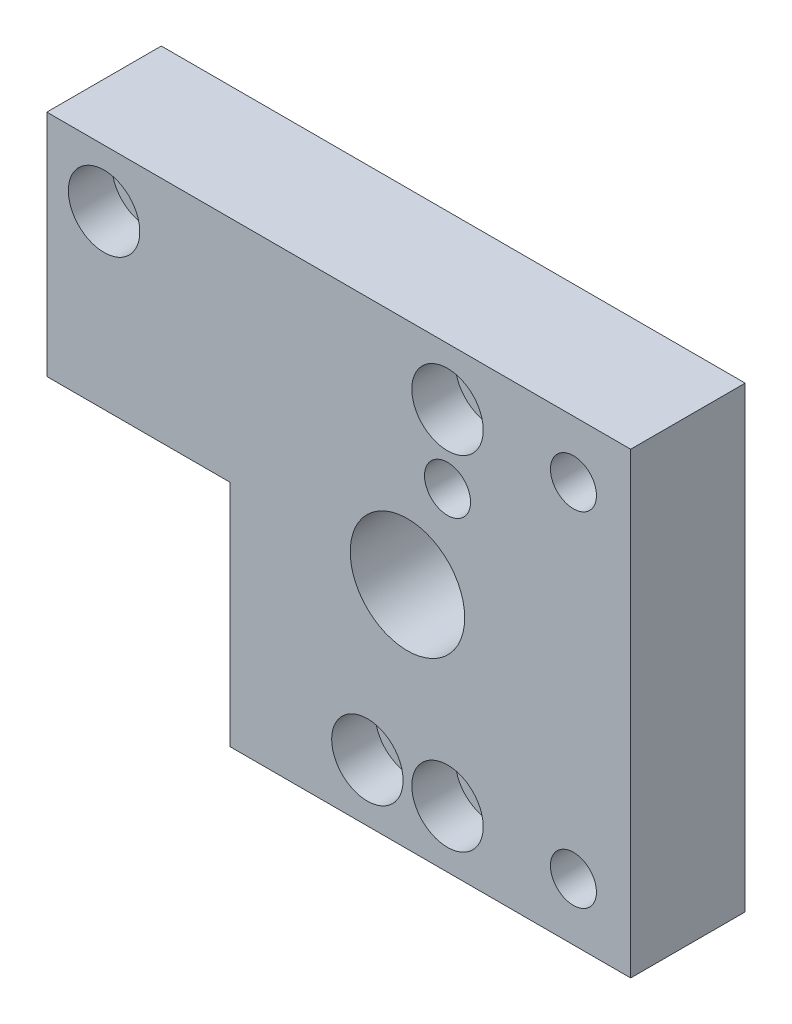
ISO-10303-21;
HEADER;
FILE_DESCRIPTION(('STEP AP214'),'2;1');
FILE_NAME('part.step','',(''),(''),'','','');
FILE_SCHEMA(('AUTOMOTIVE_DESIGN { 1 0 10303 214 1 1 1 1 }'));
ENDSEC;
DATA;
#1=APPLICATION_CONTEXT('core data for automotive mechanical design processes');
#2=APPLICATION_PROTOCOL_DEFINITION('international standard','automotive_design',2000,#1);
#3=PRODUCT_CONTEXT('',#1,'mechanical');
#4=PRODUCT('Part','Part','',(#3));
#5=PRODUCT_RELATED_PRODUCT_CATEGORY('part','',(#4));
#6=PRODUCT_DEFINITION_FORMATION('','',#4);
#7=PRODUCT_DEFINITION_CONTEXT('part definition',#1,'design');
#8=PRODUCT_DEFINITION('design','',#6,#7);
#9=PRODUCT_DEFINITION_SHAPE('','',#8);
#10=(LENGTH_UNIT() NAMED_UNIT(*) SI_UNIT(.MILLI.,.METRE.));
#11=(NAMED_UNIT(*) PLANE_ANGLE_UNIT() SI_UNIT($,.RADIAN.));
#12=(NAMED_UNIT(*) SI_UNIT($,.STERADIAN.) SOLID_ANGLE_UNIT());
#13=UNCERTAINTY_MEASURE_WITH_UNIT(LENGTH_MEASURE(1.E-05),#10,'distance_accuracy_value','');
#14=(GEOMETRIC_REPRESENTATION_CONTEXT(3) GLOBAL_UNCERTAINTY_ASSIGNED_CONTEXT((#13)) GLOBAL_UNIT_ASSIGNED_CONTEXT((#10,
#11,#12)) REPRESENTATION_CONTEXT('',''));
#15=CARTESIAN_POINT('',(0.,0.,0.));
#16=DIRECTION('',(0.,0.,1.));
#17=DIRECTION('',(1.,0.,0.));
#18=AXIS2_PLACEMENT_3D('',#15,#16,#17);
#19=CARTESIAN_POINT('',(0.,0.,12.7));
#20=DIRECTION('',(0.,0.,-1.));
#21=DIRECTION('',(-1.,0.,0.));
#22=AXIS2_PLACEMENT_3D('',#19,#20,#21);
#23=PLANE('',#22);
#24=CARTESIAN_POINT('',(19.05,-19.05,12.7));
#25=DIRECTION('',(0.,0.,-1.));
#26=DIRECTION('',(-1.,0.,0.));
#27=AXIS2_PLACEMENT_3D('',#24,#25,#26);
#28=CIRCLE('',#27,3.9624);
#29=CARTESIAN_POINT('',(15.0876,-19.05,12.7));
#30=VERTEX_POINT('',#29);
#31=EDGE_CURVE('E152',#30,#30,#28,.T.);
#32=ORIENTED_EDGE('',*,*,#31,.T.);
#33=EDGE_LOOP('',(#32));
#34=FACE_BOUND('',#33,.T.);
#35=CARTESIAN_POINT('',(19.05,19.05,12.7));
#36=DIRECTION('',(0.,0.,-1.));
#37=DIRECTION('',(-1.,0.,0.));
#38=AXIS2_PLACEMENT_3D('',#35,#36,#37);
#39=CIRCLE('',#38,3.9624);
#40=CARTESIAN_POINT('',(15.0876,19.05,12.7));
#41=VERTEX_POINT('',#40);
#42=EDGE_CURVE('E141',#41,#41,#39,.T.);
#43=ORIENTED_EDGE('',*,*,#42,.T.);
#44=EDGE_LOOP('',(#43));
#45=FACE_BOUND('',#44,.T.);
#46=CARTESIAN_POINT('',(33.02,-19.05,12.7));
#47=DIRECTION('',(0.,0.,-1.));
#48=DIRECTION('',(-1.,0.,0.));
#49=AXIS2_PLACEMENT_3D('',#46,#47,#48);
#50=CIRCLE('',#49,2.55269999999999);
#51=CARTESIAN_POINT('',(30.4673,-19.05,12.7));
#52=VERTEX_POINT('',#51);
#53=EDGE_CURVE('E170',#52,#52,#50,.T.);
#54=ORIENTED_EDGE('',*,*,#53,.T.);
#55=EDGE_LOOP('',(#54));
#56=FACE_BOUND('',#55,.T.);
#57=CARTESIAN_POINT('',(33.02,19.05,12.7));
#58=DIRECTION('',(0.,0.,-1.));
#59=DIRECTION('',(-1.,0.,0.));
#60=AXIS2_PLACEMENT_3D('',#57,#58,#59);
#61=CIRCLE('',#60,2.55269999999999);
#62=CARTESIAN_POINT('',(30.4673,19.05,12.7));
#63=VERTEX_POINT('',#62);
#64=EDGE_CURVE('E176',#63,#63,#61,.T.);
#65=ORIENTED_EDGE('',*,*,#64,.T.);
#66=EDGE_LOOP('',(#65));
#67=FACE_BOUND('',#66,.T.);
#68=CARTESIAN_POINT('',(19.05,11.43,12.7));
#69=DIRECTION('',(0.,0.,-1.));
#70=DIRECTION('',(-1.,0.,0.));
#71=AXIS2_PLACEMENT_3D('',#68,#69,#70);
#72=CIRCLE('',#71,2.55269999999999);
#73=CARTESIAN_POINT('',(16.4973,11.43,12.7));
#74=VERTEX_POINT('',#73);
#75=EDGE_CURVE('E182',#74,#74,#72,.T.);
#76=ORIENTED_EDGE('',*,*,#75,.T.);
#77=EDGE_LOOP('',(#76));
#78=FACE_BOUND('',#77,.T.);
#79=DIRECTION('',(1.,0.,0.));
#80=VECTOR('',#79,1.);
#81=CARTESIAN_POINT('',(-25.4,0.,12.7));
#82=LINE('',#81,#80);
#83=CARTESIAN_POINT('',(-25.4,0.,12.7));
#84=VERTEX_POINT('',#83);
#85=CARTESIAN_POINT('',(-5.08,0.,12.7));
#86=VERTEX_POINT('',#85);
#87=EDGE_CURVE('E96',#84,#86,#82,.T.);
#88=ORIENTED_EDGE('',*,*,#87,.T.);
#89=DIRECTION('',(0.,-1.,0.));
#90=VECTOR('',#89,1.);
#91=CARTESIAN_POINT('',(-5.08,-25.4,12.7));
#92=LINE('',#91,#90);
#93=CARTESIAN_POINT('',(-5.08,-25.4,12.7));
#94=VERTEX_POINT('',#93);
#95=EDGE_CURVE('E105',#86,#94,#92,.T.);
#96=ORIENTED_EDGE('',*,*,#95,.T.);
#97=DIRECTION('',(1.,0.,0.));
#98=VECTOR('',#97,1.);
#99=CARTESIAN_POINT('',(-25.4,-25.4,12.7));
#100=LINE('',#99,#98);
#101=CARTESIAN_POINT('',(39.37,-25.4,12.7));
#102=VERTEX_POINT('',#101);
#103=EDGE_CURVE('E59',#94,#102,#100,.T.);
#104=ORIENTED_EDGE('',*,*,#103,.T.);
#105=DIRECTION('',(0.,1.,0.));
#106=VECTOR('',#105,1.);
#107=CARTESIAN_POINT('',(39.37,-25.4,12.7));
#108=LINE('',#107,#106);
#109=CARTESIAN_POINT('',(39.37,25.4,12.7));
#110=VERTEX_POINT('',#109);
#111=EDGE_CURVE('E120',#102,#110,#108,.T.);
#112=ORIENTED_EDGE('',*,*,#111,.T.);
#113=DIRECTION('',(-1.,0.,0.));
#114=VECTOR('',#113,1.);
#115=CARTESIAN_POINT('',(-25.4,25.4,12.7));
#116=LINE('',#115,#114);
#117=CARTESIAN_POINT('',(-25.4,25.4,12.7));
#118=VERTEX_POINT('',#117);
#119=EDGE_CURVE('E81',#110,#118,#116,.T.);
#120=ORIENTED_EDGE('',*,*,#119,.T.);
#121=DIRECTION('',(0.,-1.,0.));
#122=VECTOR('',#121,1.);
#123=CARTESIAN_POINT('',(-25.4,-25.4,12.7));
#124=LINE('',#123,#122);
#125=EDGE_CURVE('E112',#118,#84,#124,.T.);
#126=ORIENTED_EDGE('',*,*,#125,.T.);
#127=EDGE_LOOP('',(#88,#96,#104,#112,#120,#126));
#128=FACE_BOUND('',#127,.T.);
#129=CARTESIAN_POINT('',(14.605,0.,12.7));
#130=DIRECTION('',(0.,0.,1.));
#131=DIRECTION('',(1.,0.,0.));
#132=AXIS2_PLACEMENT_3D('',#129,#130,#131);
#133=CIRCLE('',#132,6.35);
#134=CARTESIAN_POINT('',(20.955,0.,12.7));
#135=VERTEX_POINT('',#134);
#136=EDGE_CURVE('E186',#135,#135,#133,.T.);
#137=ORIENTED_EDGE('',*,*,#136,.F.);
#138=EDGE_LOOP('',(#137));
#139=FACE_BOUND('',#138,.T.);
#140=CARTESIAN_POINT('',(10.16,-19.05,12.7));
#141=DIRECTION('',(0.,0.,-1.));
#142=DIRECTION('',(-1.,0.,0.));
#143=AXIS2_PLACEMENT_3D('',#140,#141,#142);
#144=CIRCLE('',#143,3.9624);
#145=CARTESIAN_POINT('',(6.1976,-19.05,12.7));
#146=VERTEX_POINT('',#145);
#147=EDGE_CURVE('E145',#146,#146,#144,.T.);
#148=ORIENTED_EDGE('',*,*,#147,.T.);
#149=EDGE_LOOP('',(#148));
#150=FACE_BOUND('',#149,.T.);
#151=CARTESIAN_POINT('',(-19.05,19.05,12.7));
#152=DIRECTION('',(0.,0.,-1.));
#153=DIRECTION('',(-1.,0.,0.));
#154=AXIS2_PLACEMENT_3D('',#151,#152,#153);
#155=CIRCLE('',#154,3.9624);
#156=CARTESIAN_POINT('',(-23.0124,19.05,12.7));
#157=VERTEX_POINT('',#156);
#158=EDGE_CURVE('E159',#157,#157,#155,.T.);
#159=ORIENTED_EDGE('',*,*,#158,.T.);
#160=EDGE_LOOP('',(#159));
#161=FACE_BOUND('',#160,.T.);
#162=ADVANCED_FACE('F33',(#34,#45,#56,#67,#78,#128,#139,#150,#161),#23,.F.);
#163=CARTESIAN_POINT('',(0.,0.,0.));
#164=DIRECTION('',(0.,0.,-1.));
#165=DIRECTION('',(-1.,0.,0.));
#166=AXIS2_PLACEMENT_3D('',#163,#164,#165);
#167=PLANE('',#166);
#168=DIRECTION('',(0.,-1.,0.));
#169=VECTOR('',#168,1.);
#170=CARTESIAN_POINT('',(-5.08,-25.4,0.));
#171=LINE('',#170,#169);
#172=CARTESIAN_POINT('',(-5.08,0.,0.));
#173=VERTEX_POINT('',#172);
#174=CARTESIAN_POINT('',(-5.08,-25.4,0.));
#175=VERTEX_POINT('',#174);
#176=EDGE_CURVE('E50',#173,#175,#171,.T.);
#177=ORIENTED_EDGE('',*,*,#176,.F.);
#178=DIRECTION('',(1.,0.,0.));
#179=VECTOR('',#178,1.);
#180=CARTESIAN_POINT('',(-25.4,0.,0.));
#181=LINE('',#180,#179);
#182=CARTESIAN_POINT('',(-25.4,0.,0.));
#183=VERTEX_POINT('',#182);
#184=EDGE_CURVE('E209',#183,#173,#181,.T.);
#185=ORIENTED_EDGE('',*,*,#184,.F.);
#186=DIRECTION('',(0.,-1.,0.));
#187=VECTOR('',#186,1.);
#188=CARTESIAN_POINT('',(-25.4,-25.4,0.));
#189=LINE('',#188,#187);
#190=CARTESIAN_POINT('',(-25.4,25.4,0.));
#191=VERTEX_POINT('',#190);
#192=EDGE_CURVE('E114',#191,#183,#189,.T.);
#193=ORIENTED_EDGE('',*,*,#192,.F.);
#194=DIRECTION('',(-1.,0.,0.));
#195=VECTOR('',#194,1.);
#196=CARTESIAN_POINT('',(-25.4,25.4,0.));
#197=LINE('',#196,#195);
#198=CARTESIAN_POINT('',(39.37,25.4,0.));
#199=VERTEX_POINT('',#198);
#200=EDGE_CURVE('E127',#199,#191,#197,.T.);
#201=ORIENTED_EDGE('',*,*,#200,.F.);
#202=DIRECTION('',(0.,1.,0.));
#203=VECTOR('',#202,1.);
#204=CARTESIAN_POINT('',(39.37,-25.4,0.));
#205=LINE('',#204,#203);
#206=CARTESIAN_POINT('',(39.37,-25.4,0.));
#207=VERTEX_POINT('',#206);
#208=EDGE_CURVE('E124',#207,#199,#205,.T.);
#209=ORIENTED_EDGE('',*,*,#208,.F.);
#210=DIRECTION('',(1.,0.,0.));
#211=VECTOR('',#210,1.);
#212=CARTESIAN_POINT('',(-25.4,-25.4,0.));
#213=LINE('',#212,#211);
#214=EDGE_CURVE('E76',#175,#207,#213,.T.);
#215=ORIENTED_EDGE('',*,*,#214,.F.);
#216=EDGE_LOOP('',(#177,#185,#193,#201,#209,#215));
#217=FACE_BOUND('',#216,.T.);
#218=CARTESIAN_POINT('',(33.02,-19.05,0.));
#219=DIRECTION('',(0.,0.,-1.));
#220=DIRECTION('',(-1.,0.,0.));
#221=AXIS2_PLACEMENT_3D('',#218,#219,#220);
#222=CIRCLE('',#221,2.55269999999999);
#223=CARTESIAN_POINT('',(30.4673,-19.05,0.));
#224=VERTEX_POINT('',#223);
#225=EDGE_CURVE('E137',#224,#224,#222,.T.);
#226=ORIENTED_EDGE('',*,*,#225,.F.);
#227=EDGE_LOOP('',(#226));
#228=FACE_BOUND('',#227,.T.);
#229=CARTESIAN_POINT('',(33.02,19.05,0.));
#230=DIRECTION('',(0.,0.,-1.));
#231=DIRECTION('',(-1.,0.,0.));
#232=AXIS2_PLACEMENT_3D('',#229,#230,#231);
#233=CIRCLE('',#232,2.55269999999999);
#234=CARTESIAN_POINT('',(30.4673,19.05,0.));
#235=VERTEX_POINT('',#234);
#236=EDGE_CURVE('E173',#235,#235,#233,.T.);
#237=ORIENTED_EDGE('',*,*,#236,.F.);
#238=EDGE_LOOP('',(#237));
#239=FACE_BOUND('',#238,.T.);
#240=CARTESIAN_POINT('',(19.05,11.43,0.));
#241=DIRECTION('',(0.,0.,-1.));
#242=DIRECTION('',(-1.,0.,0.));
#243=AXIS2_PLACEMENT_3D('',#240,#241,#242);
#244=CIRCLE('',#243,2.55269999999999);
#245=CARTESIAN_POINT('',(16.4973,11.43,0.));
#246=VERTEX_POINT('',#245);
#247=EDGE_CURVE('E179',#246,#246,#244,.T.);
#248=ORIENTED_EDGE('',*,*,#247,.F.);
#249=EDGE_LOOP('',(#248));
#250=FACE_BOUND('',#249,.T.);
#251=CARTESIAN_POINT('',(10.16,-19.05,0.));
#252=DIRECTION('',(0.,0.,1.));
#253=DIRECTION('',(1.,0.,0.));
#254=AXIS2_PLACEMENT_3D('',#251,#252,#253);
#255=CIRCLE('',#254,2.5527);
#256=CARTESIAN_POINT('',(12.7127,-19.05,0.));
#257=VERTEX_POINT('',#256);
#258=EDGE_CURVE('E189',#257,#257,#255,.T.);
#259=ORIENTED_EDGE('',*,*,#258,.T.);
#260=EDGE_LOOP('',(#259));
#261=FACE_BOUND('',#260,.T.);
#262=CARTESIAN_POINT('',(19.05,19.05,0.));
#263=DIRECTION('',(0.,0.,1.));
#264=DIRECTION('',(1.,0.,0.));
#265=AXIS2_PLACEMENT_3D('',#262,#263,#264);
#266=CIRCLE('',#265,2.55269999999999);
#267=CARTESIAN_POINT('',(21.6027,19.05,0.));
#268=VERTEX_POINT('',#267);
#269=EDGE_CURVE('E197',#268,#268,#266,.T.);
#270=ORIENTED_EDGE('',*,*,#269,.T.);
#271=EDGE_LOOP('',(#270));
#272=FACE_BOUND('',#271,.T.);
#273=CARTESIAN_POINT('',(-19.05,19.05,0.));
#274=DIRECTION('',(0.,0.,1.));
#275=DIRECTION('',(-1.,0.,0.));
#276=AXIS2_PLACEMENT_3D('',#273,#274,#275);
#277=CIRCLE('',#276,2.55269999999999);
#278=CARTESIAN_POINT('',(-21.6027,19.05,0.));
#279=VERTEX_POINT('',#278);
#280=EDGE_CURVE('E128',#279,#279,#277,.T.);
#281=ORIENTED_EDGE('',*,*,#280,.T.);
#282=EDGE_LOOP('',(#281));
#283=FACE_BOUND('',#282,.T.);
#284=CARTESIAN_POINT('',(19.05,-19.05,0.));
#285=DIRECTION('',(0.,0.,1.));
#286=DIRECTION('',(1.,0.,0.));
#287=AXIS2_PLACEMENT_3D('',#284,#285,#286);
#288=CIRCLE('',#287,2.5527);
#289=CARTESIAN_POINT('',(21.6027,-19.05,0.));
#290=VERTEX_POINT('',#289);
#291=EDGE_CURVE('E194',#290,#290,#288,.T.);
#292=ORIENTED_EDGE('',*,*,#291,.T.);
#293=EDGE_LOOP('',(#292));
#294=FACE_BOUND('',#293,.T.);
#295=CARTESIAN_POINT('',(14.605,0.,0.));
#296=DIRECTION('',(0.,0.,1.));
#297=DIRECTION('',(1.,0.,0.));
#298=AXIS2_PLACEMENT_3D('',#295,#296,#297);
#299=CIRCLE('',#298,6.35);
#300=CARTESIAN_POINT('',(20.955,0.,0.));
#301=VERTEX_POINT('',#300);
#302=EDGE_CURVE('E185',#301,#301,#299,.T.);
#303=ORIENTED_EDGE('',*,*,#302,.T.);
#304=EDGE_LOOP('',(#303));
#305=FACE_BOUND('',#304,.T.);
#306=ADVANCED_FACE('F207',(#217,#228,#239,#250,#261,#272,#283,#294,#305),#167,.T.);
#307=CARTESIAN_POINT('',(39.37,-25.4,12.7));
#308=DIRECTION('',(-1.,0.,0.));
#309=DIRECTION('',(0.,0.,1.));
#310=AXIS2_PLACEMENT_3D('',#307,#308,#309);
#311=PLANE('',#310);
#312=ORIENTED_EDGE('',*,*,#208,.T.);
#313=DIRECTION('',(0.,0.,-1.));
#314=VECTOR('',#313,1.);
#315=CARTESIAN_POINT('',(39.37,25.4,12.7));
#316=LINE('',#315,#314);
#317=EDGE_CURVE('E11',#110,#199,#316,.T.);
#318=ORIENTED_EDGE('',*,*,#317,.F.);
#319=ORIENTED_EDGE('',*,*,#111,.F.);
#320=DIRECTION('',(0.,0.,-1.));
#321=VECTOR('',#320,1.);
#322=CARTESIAN_POINT('',(39.37,-25.4,12.7));
#323=LINE('',#322,#321);
#324=EDGE_CURVE('E118',#102,#207,#323,.T.);
#325=ORIENTED_EDGE('',*,*,#324,.T.);
#326=EDGE_LOOP('',(#312,#318,#319,#325));
#327=FACE_BOUND('',#326,.T.);
#328=ADVANCED_FACE('F35',(#327),#311,.F.);
#329=CARTESIAN_POINT('',(-25.4,25.4,12.7));
#330=DIRECTION('',(0.,-1.,0.));
#331=DIRECTION('',(1.,0.,0.));
#332=AXIS2_PLACEMENT_3D('',#329,#330,#331);
#333=PLANE('',#332);
#334=ORIENTED_EDGE('',*,*,#200,.T.);
#335=DIRECTION('',(0.,0.,-1.));
#336=VECTOR('',#335,1.);
#337=CARTESIAN_POINT('',(-25.4,25.4,12.7));
#338=LINE('',#337,#336);
#339=EDGE_CURVE('E42',#118,#191,#338,.T.);
#340=ORIENTED_EDGE('',*,*,#339,.F.);
#341=ORIENTED_EDGE('',*,*,#119,.F.);
#342=ORIENTED_EDGE('',*,*,#317,.T.);
#343=EDGE_LOOP('',(#334,#340,#341,#342));
#344=FACE_BOUND('',#343,.T.);
#345=ADVANCED_FACE('F205',(#344),#333,.F.);
#346=CARTESIAN_POINT('',(-25.4,-25.4,12.7));
#347=DIRECTION('',(1.,0.,0.));
#348=DIRECTION('',(0.,0.,-1.));
#349=AXIS2_PLACEMENT_3D('',#346,#347,#348);
#350=PLANE('',#349);
#351=ORIENTED_EDGE('',*,*,#192,.T.);
#352=DIRECTION('',(0.,0.,-1.));
#353=VECTOR('',#352,1.);
#354=CARTESIAN_POINT('',(-25.4,0.,12.7));
#355=LINE('',#354,#353);
#356=EDGE_CURVE('E100',#84,#183,#355,.T.);
#357=ORIENTED_EDGE('',*,*,#356,.F.);
#358=ORIENTED_EDGE('',*,*,#125,.F.);
#359=ORIENTED_EDGE('',*,*,#339,.T.);
#360=EDGE_LOOP('',(#351,#357,#358,#359));
#361=FACE_BOUND('',#360,.T.);
#362=ADVANCED_FACE('F110',(#361),#350,.F.);
#363=CARTESIAN_POINT('',(-25.4,-25.4,12.7));
#364=DIRECTION('',(0.,1.,0.));
#365=DIRECTION('',(0.,0.,1.));
#366=AXIS2_PLACEMENT_3D('',#363,#364,#365);
#367=PLANE('',#366);
#368=ORIENTED_EDGE('',*,*,#103,.F.);
#369=DIRECTION('',(0.,0.,-1.));
#370=VECTOR('',#369,1.);
#371=CARTESIAN_POINT('',(-5.08,-25.4,12.7));
#372=LINE('',#371,#370);
#373=EDGE_CURVE('E214',#94,#175,#372,.T.);
#374=ORIENTED_EDGE('',*,*,#373,.T.);
#375=ORIENTED_EDGE('',*,*,#214,.T.);
#376=ORIENTED_EDGE('',*,*,#324,.F.);
#377=EDGE_LOOP('',(#368,#374,#375,#376));
#378=FACE_BOUND('',#377,.T.);
#379=ADVANCED_FACE('F251',(#378),#367,.F.);
#380=CARTESIAN_POINT('',(-19.05,19.05,12.7));
#381=DIRECTION('',(0.,0.,-1.));
#382=DIRECTION('',(-1.,0.,0.));
#383=AXIS2_PLACEMENT_3D('',#380,#381,#382);
#384=CYLINDRICAL_SURFACE('',#383,2.55269999999999);
#385=CARTESIAN_POINT('',(-19.05,19.05,7.874));
#386=DIRECTION('',(0.,0.,-1.));
#387=DIRECTION('',(-1.,0.,0.));
#388=AXIS2_PLACEMENT_3D('',#385,#386,#387);
#389=CIRCLE('',#388,2.55269999999999);
#390=CARTESIAN_POINT('',(-21.6027,19.05,7.874));
#391=VERTEX_POINT('',#390);
#392=EDGE_CURVE('E37',#391,#391,#389,.T.);
#393=ORIENTED_EDGE('',*,*,#392,.F.);
#394=EDGE_LOOP('',(#393));
#395=FACE_BOUND('',#394,.T.);
#396=ORIENTED_EDGE('',*,*,#280,.F.);
#397=EDGE_LOOP('',(#396));
#398=FACE_BOUND('',#397,.T.);
#399=ADVANCED_FACE('F248',(#395,#398),#384,.F.);
#400=CARTESIAN_POINT('',(19.05,19.05,12.7));
#401=DIRECTION('',(0.,0.,-1.));
#402=DIRECTION('',(-1.,0.,0.));
#403=AXIS2_PLACEMENT_3D('',#400,#401,#402);
#404=CYLINDRICAL_SURFACE('',#403,2.55269999999999);
#405=CARTESIAN_POINT('',(19.05,19.05,7.874));
#406=DIRECTION('',(0.,0.,-1.));
#407=DIRECTION('',(-1.,0.,0.));
#408=AXIS2_PLACEMENT_3D('',#405,#406,#407);
#409=CIRCLE('',#408,2.55269999999999);
#410=CARTESIAN_POINT('',(16.4973,19.05,7.874));
#411=VERTEX_POINT('',#410);
#412=EDGE_CURVE('E134',#411,#411,#409,.T.);
#413=ORIENTED_EDGE('',*,*,#412,.F.);
#414=EDGE_LOOP('',(#413));
#415=FACE_BOUND('',#414,.T.);
#416=ORIENTED_EDGE('',*,*,#269,.F.);
#417=EDGE_LOOP('',(#416));
#418=FACE_BOUND('',#417,.T.);
#419=ADVANCED_FACE('F387',(#415,#418),#404,.F.);
#420=CARTESIAN_POINT('',(19.05,-19.05,12.7));
#421=DIRECTION('',(0.,0.,-1.));
#422=DIRECTION('',(-1.,0.,0.));
#423=AXIS2_PLACEMENT_3D('',#420,#421,#422);
#424=CYLINDRICAL_SURFACE('',#423,2.5527);
#425=CARTESIAN_POINT('',(19.05,-19.05,7.874));
#426=DIRECTION('',(0.,0.,-1.));
#427=DIRECTION('',(-1.,0.,0.));
#428=AXIS2_PLACEMENT_3D('',#425,#426,#427);
#429=CIRCLE('',#428,2.5527);
#430=CARTESIAN_POINT('',(16.4973,-19.05,7.874));
#431=VERTEX_POINT('',#430);
#432=EDGE_CURVE('E143',#431,#431,#429,.T.);
#433=ORIENTED_EDGE('',*,*,#432,.F.);
#434=EDGE_LOOP('',(#433));
#435=FACE_BOUND('',#434,.T.);
#436=ORIENTED_EDGE('',*,*,#291,.F.);
#437=EDGE_LOOP('',(#436));
#438=FACE_BOUND('',#437,.T.);
#439=ADVANCED_FACE('F375',(#435,#438),#424,.F.);
#440=CARTESIAN_POINT('',(10.16,-19.05,12.7));
#441=DIRECTION('',(0.,0.,-1.));
#442=DIRECTION('',(-1.,0.,0.));
#443=AXIS2_PLACEMENT_3D('',#440,#441,#442);
#444=CYLINDRICAL_SURFACE('',#443,2.5527);
#445=CARTESIAN_POINT('',(10.16,-19.05,7.874));
#446=DIRECTION('',(0.,0.,-1.));
#447=DIRECTION('',(-1.,0.,0.));
#448=AXIS2_PLACEMENT_3D('',#445,#446,#447);
#449=CIRCLE('',#448,2.5527);
#450=CARTESIAN_POINT('',(7.6073,-19.05,7.874));
#451=VERTEX_POINT('',#450);
#452=EDGE_CURVE('E139',#451,#451,#449,.T.);
#453=ORIENTED_EDGE('',*,*,#452,.F.);
#454=EDGE_LOOP('',(#453));
#455=FACE_BOUND('',#454,.T.);
#456=ORIENTED_EDGE('',*,*,#258,.F.);
#457=EDGE_LOOP('',(#456));
#458=FACE_BOUND('',#457,.T.);
#459=ADVANCED_FACE('F369',(#455,#458),#444,.F.);
#460=CARTESIAN_POINT('',(14.605,0.,12.7));
#461=DIRECTION('',(0.,0.,-1.));
#462=DIRECTION('',(-1.,0.,0.));
#463=AXIS2_PLACEMENT_3D('',#460,#461,#462);
#464=CYLINDRICAL_SURFACE('',#463,6.35);
#465=ORIENTED_EDGE('',*,*,#136,.T.);
#466=EDGE_LOOP('',(#465));
#467=FACE_BOUND('',#466,.T.);
#468=ORIENTED_EDGE('',*,*,#302,.F.);
#469=EDGE_LOOP('',(#468));
#470=FACE_BOUND('',#469,.T.);
#471=ADVANCED_FACE('F374',(#467,#470),#464,.F.);
#472=CARTESIAN_POINT('',(19.05,11.43,0.));
#473=DIRECTION('',(0.,0.,-1.));
#474=DIRECTION('',(-1.,0.,0.));
#475=AXIS2_PLACEMENT_3D('',#472,#473,#474);
#476=CYLINDRICAL_SURFACE('',#475,2.55269999999999);
#477=ORIENTED_EDGE('',*,*,#247,.T.);
#478=EDGE_LOOP('',(#477));
#479=FACE_BOUND('',#478,.T.);
#480=ORIENTED_EDGE('',*,*,#75,.F.);
#481=EDGE_LOOP('',(#480));
#482=FACE_BOUND('',#481,.T.);
#483=ADVANCED_FACE('F420',(#479,#482),#476,.F.);
#484=CARTESIAN_POINT('',(33.02,19.05,0.));
#485=DIRECTION('',(0.,0.,-1.));
#486=DIRECTION('',(-1.,0.,0.));
#487=AXIS2_PLACEMENT_3D('',#484,#485,#486);
#488=CYLINDRICAL_SURFACE('',#487,2.55269999999999);
#489=ORIENTED_EDGE('',*,*,#236,.T.);
#490=EDGE_LOOP('',(#489));
#491=FACE_BOUND('',#490,.T.);
#492=ORIENTED_EDGE('',*,*,#64,.F.);
#493=EDGE_LOOP('',(#492));
#494=FACE_BOUND('',#493,.T.);
#495=ADVANCED_FACE('F410',(#491,#494),#488,.F.);
#496=CARTESIAN_POINT('',(33.02,-19.05,0.));
#497=DIRECTION('',(0.,0.,-1.));
#498=DIRECTION('',(-1.,0.,0.));
#499=AXIS2_PLACEMENT_3D('',#496,#497,#498);
#500=CYLINDRICAL_SURFACE('',#499,2.55269999999999);
#501=ORIENTED_EDGE('',*,*,#225,.T.);
#502=EDGE_LOOP('',(#501));
#503=FACE_BOUND('',#502,.T.);
#504=ORIENTED_EDGE('',*,*,#53,.F.);
#505=EDGE_LOOP('',(#504));
#506=FACE_BOUND('',#505,.T.);
#507=ADVANCED_FACE('F362',(#503,#506),#500,.F.);
#508=CARTESIAN_POINT('',(19.05,19.05,7.874));
#509=DIRECTION('',(0.,0.,1.));
#510=DIRECTION('',(1.,0.,0.));
#511=AXIS2_PLACEMENT_3D('',#508,#509,#510);
#512=CYLINDRICAL_SURFACE('',#511,3.9624);
#513=CARTESIAN_POINT('',(19.05,19.05,7.874));
#514=DIRECTION('',(0.,0.,-1.));
#515=DIRECTION('',(-1.,0.,0.));
#516=AXIS2_PLACEMENT_3D('',#513,#514,#515);
#517=CIRCLE('',#516,3.9624);
#518=CARTESIAN_POINT('',(15.0876,19.05,7.874));
#519=VERTEX_POINT('',#518);
#520=EDGE_CURVE('E138',#519,#519,#517,.T.);
#521=ORIENTED_EDGE('',*,*,#520,.T.);
#522=EDGE_LOOP('',(#521));
#523=FACE_BOUND('',#522,.T.);
#524=ORIENTED_EDGE('',*,*,#42,.F.);
#525=EDGE_LOOP('',(#524));
#526=FACE_BOUND('',#525,.T.);
#527=ADVANCED_FACE('F352',(#523,#526),#512,.F.);
#528=CARTESIAN_POINT('',(19.05,19.05,7.874));
#529=DIRECTION('',(0.,0.,-1.));
#530=DIRECTION('',(-1.,0.,0.));
#531=AXIS2_PLACEMENT_3D('',#528,#529,#530);
#532=PLANE('',#531);
#533=ORIENTED_EDGE('',*,*,#412,.T.);
#534=EDGE_LOOP('',(#533));
#535=FACE_BOUND('',#534,.T.);
#536=ORIENTED_EDGE('',*,*,#520,.F.);
#537=EDGE_LOOP('',(#536));
#538=FACE_BOUND('',#537,.T.);
#539=ADVANCED_FACE('F342',(#535,#538),#532,.F.);
#540=CARTESIAN_POINT('',(10.16,-19.05,7.874));
#541=DIRECTION('',(0.,0.,1.));
#542=DIRECTION('',(1.,0.,0.));
#543=AXIS2_PLACEMENT_3D('',#540,#541,#542);
#544=CYLINDRICAL_SURFACE('',#543,3.9624);
#545=CARTESIAN_POINT('',(10.16,-19.05,7.874));
#546=DIRECTION('',(0.,0.,-1.));
#547=DIRECTION('',(-1.,0.,0.));
#548=AXIS2_PLACEMENT_3D('',#545,#546,#547);
#549=CIRCLE('',#548,3.9624);
#550=CARTESIAN_POINT('',(6.1976,-19.05,7.874));
#551=VERTEX_POINT('',#550);
#552=EDGE_CURVE('E142',#551,#551,#549,.T.);
#553=ORIENTED_EDGE('',*,*,#552,.T.);
#554=EDGE_LOOP('',(#553));
#555=FACE_BOUND('',#554,.T.);
#556=ORIENTED_EDGE('',*,*,#147,.F.);
#557=EDGE_LOOP('',(#556));
#558=FACE_BOUND('',#557,.T.);
#559=ADVANCED_FACE('F332',(#555,#558),#544,.F.);
#560=CARTESIAN_POINT('',(10.16,-19.05,7.874));
#561=DIRECTION('',(0.,0.,-1.));
#562=DIRECTION('',(-1.,0.,0.));
#563=AXIS2_PLACEMENT_3D('',#560,#561,#562);
#564=PLANE('',#563);
#565=ORIENTED_EDGE('',*,*,#452,.T.);
#566=EDGE_LOOP('',(#565));
#567=FACE_BOUND('',#566,.T.);
#568=ORIENTED_EDGE('',*,*,#552,.F.);
#569=EDGE_LOOP('',(#568));
#570=FACE_BOUND('',#569,.T.);
#571=ADVANCED_FACE('F323',(#567,#570),#564,.F.);
#572=CARTESIAN_POINT('',(19.05,-19.05,7.874));
#573=DIRECTION('',(0.,0.,1.));
#574=DIRECTION('',(1.,0.,0.));
#575=AXIS2_PLACEMENT_3D('',#572,#573,#574);
#576=CYLINDRICAL_SURFACE('',#575,3.9624);
#577=CARTESIAN_POINT('',(19.05,-19.05,7.874));
#578=DIRECTION('',(0.,0.,-1.));
#579=DIRECTION('',(-1.,0.,0.));
#580=AXIS2_PLACEMENT_3D('',#577,#578,#579);
#581=CIRCLE('',#580,3.9624);
#582=CARTESIAN_POINT('',(15.0876,-19.05,7.874));
#583=VERTEX_POINT('',#582);
#584=EDGE_CURVE('E146',#583,#583,#581,.T.);
#585=ORIENTED_EDGE('',*,*,#584,.T.);
#586=EDGE_LOOP('',(#585));
#587=FACE_BOUND('',#586,.T.);
#588=ORIENTED_EDGE('',*,*,#31,.F.);
#589=EDGE_LOOP('',(#588));
#590=FACE_BOUND('',#589,.T.);
#591=ADVANCED_FACE('F237',(#587,#590),#576,.F.);
#592=CARTESIAN_POINT('',(19.05,-19.05,7.874));
#593=DIRECTION('',(0.,0.,-1.));
#594=DIRECTION('',(-1.,0.,0.));
#595=AXIS2_PLACEMENT_3D('',#592,#593,#594);
#596=PLANE('',#595);
#597=ORIENTED_EDGE('',*,*,#432,.T.);
#598=EDGE_LOOP('',(#597));
#599=FACE_BOUND('',#598,.T.);
#600=ORIENTED_EDGE('',*,*,#584,.F.);
#601=EDGE_LOOP('',(#600));
#602=FACE_BOUND('',#601,.T.);
#603=ADVANCED_FACE('F228',(#599,#602),#596,.F.);
#604=CARTESIAN_POINT('',(-19.05,19.05,7.874));
#605=DIRECTION('',(0.,0.,1.));
#606=DIRECTION('',(1.,0.,0.));
#607=AXIS2_PLACEMENT_3D('',#604,#605,#606);
#608=CYLINDRICAL_SURFACE('',#607,3.9624);
#609=CARTESIAN_POINT('',(-19.05,19.05,7.874));
#610=DIRECTION('',(0.,0.,-1.));
#611=DIRECTION('',(-1.,0.,0.));
#612=AXIS2_PLACEMENT_3D('',#609,#610,#611);
#613=CIRCLE('',#612,3.9624);
#614=CARTESIAN_POINT('',(-23.0124,19.05,7.874));
#615=VERTEX_POINT('',#614);
#616=EDGE_CURVE('E216',#615,#615,#613,.T.);
#617=ORIENTED_EDGE('',*,*,#616,.T.);
#618=EDGE_LOOP('',(#617));
#619=FACE_BOUND('',#618,.T.);
#620=ORIENTED_EDGE('',*,*,#158,.F.);
#621=EDGE_LOOP('',(#620));
#622=FACE_BOUND('',#621,.T.);
#623=ADVANCED_FACE('F225',(#619,#622),#608,.F.);
#624=CARTESIAN_POINT('',(-19.05,19.05,7.874));
#625=DIRECTION('',(0.,0.,-1.));
#626=DIRECTION('',(-1.,0.,0.));
#627=AXIS2_PLACEMENT_3D('',#624,#625,#626);
#628=PLANE('',#627);
#629=ORIENTED_EDGE('',*,*,#392,.T.);
#630=EDGE_LOOP('',(#629));
#631=FACE_BOUND('',#630,.T.);
#632=ORIENTED_EDGE('',*,*,#616,.F.);
#633=EDGE_LOOP('',(#632));
#634=FACE_BOUND('',#633,.T.);
#635=ADVANCED_FACE('F227',(#631,#634),#628,.F.);
#636=CARTESIAN_POINT('',(-5.08,-25.4,12.7));
#637=DIRECTION('',(1.,0.,0.));
#638=DIRECTION('',(0.,0.,-1.));
#639=AXIS2_PLACEMENT_3D('',#636,#637,#638);
#640=PLANE('',#639);
#641=ORIENTED_EDGE('',*,*,#176,.T.);
#642=ORIENTED_EDGE('',*,*,#373,.F.);
#643=ORIENTED_EDGE('',*,*,#95,.F.);
#644=DIRECTION('',(0.,0.,-1.));
#645=VECTOR('',#644,1.);
#646=CARTESIAN_POINT('',(-5.08,0.,12.7));
#647=LINE('',#646,#645);
#648=EDGE_CURVE('E102',#86,#173,#647,.T.);
#649=ORIENTED_EDGE('',*,*,#648,.T.);
#650=EDGE_LOOP('',(#641,#642,#643,#649));
#651=FACE_BOUND('',#650,.T.);
#652=ADVANCED_FACE('F234',(#651),#640,.F.);
#653=CARTESIAN_POINT('',(-25.4,0.,12.7));
#654=DIRECTION('',(0.,1.,0.));
#655=DIRECTION('',(-1.,0.,0.));
#656=AXIS2_PLACEMENT_3D('',#653,#654,#655);
#657=PLANE('',#656);
#658=ORIENTED_EDGE('',*,*,#184,.T.);
#659=ORIENTED_EDGE('',*,*,#648,.F.);
#660=ORIENTED_EDGE('',*,*,#87,.F.);
#661=ORIENTED_EDGE('',*,*,#356,.T.);
#662=EDGE_LOOP('',(#658,#659,#660,#661));
#663=FACE_BOUND('',#662,.T.);
#664=ADVANCED_FACE('F99',(#663),#657,.F.);
#665=CLOSED_SHELL('',(#162,#306,#328,#345,#362,#379,#399,#419,#439,#459,#471,#483,#495,#507,
#527,#539,#559,#571,#591,#603,#623,#635,#652,#664));
#666=MANIFOLD_SOLID_BREP('B2',#665);
#667=ADVANCED_BREP_SHAPE_REPRESENTATION('',(#18,#666),#14);
#668=SHAPE_DEFINITION_REPRESENTATION(#9,#667);
ENDSEC;
END-ISO-10303-21;
